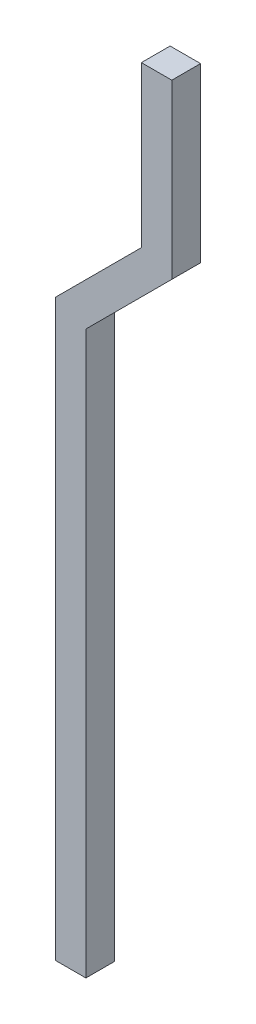
ISO-10303-21;
HEADER;
FILE_DESCRIPTION(('STEP AP214'),'2;1');
FILE_NAME('part.step','',(''),(''),'','','');
FILE_SCHEMA(('AUTOMOTIVE_DESIGN { 1 0 10303 214 1 1 1 1 }'));
ENDSEC;
DATA;
#1=APPLICATION_CONTEXT('core data for automotive mechanical design processes');
#2=APPLICATION_PROTOCOL_DEFINITION('international standard','automotive_design',2000,#1);
#3=PRODUCT_CONTEXT('',#1,'mechanical');
#4=PRODUCT('Part','Part','',(#3));
#5=PRODUCT_RELATED_PRODUCT_CATEGORY('part','',(#4));
#6=PRODUCT_DEFINITION_FORMATION('','',#4);
#7=PRODUCT_DEFINITION_CONTEXT('part definition',#1,'design');
#8=PRODUCT_DEFINITION('design','',#6,#7);
#9=PRODUCT_DEFINITION_SHAPE('','',#8);
#10=(LENGTH_UNIT() NAMED_UNIT(*) SI_UNIT(.MILLI.,.METRE.));
#11=(NAMED_UNIT(*) PLANE_ANGLE_UNIT() SI_UNIT($,.RADIAN.));
#12=(NAMED_UNIT(*) SI_UNIT($,.STERADIAN.) SOLID_ANGLE_UNIT());
#13=UNCERTAINTY_MEASURE_WITH_UNIT(LENGTH_MEASURE(1.E-05),#10,'distance_accuracy_value','');
#14=(GEOMETRIC_REPRESENTATION_CONTEXT(3) GLOBAL_UNCERTAINTY_ASSIGNED_CONTEXT((#13)) GLOBAL_UNIT_ASSIGNED_CONTEXT((#10,
#11,#12)) REPRESENTATION_CONTEXT('',''));
#15=CARTESIAN_POINT('',(0.,0.,0.));
#16=DIRECTION('',(0.,0.,1.));
#17=DIRECTION('',(1.,0.,0.));
#18=AXIS2_PLACEMENT_3D('',#15,#16,#17);
#19=CARTESIAN_POINT('',(-0.90050874,-6.350508,0.44500038));
#20=DIRECTION('',(0.,0.,-1.));
#21=DIRECTION('',(-1.,0.,0.));
#22=AXIS2_PLACEMENT_3D('',#19,#20,#21);
#23=PLANE('',#22);
#24=DIRECTION('',(0.,1.,0.));
#25=VECTOR('',#24,1.);
#26=CARTESIAN_POINT('',(-0.90050874,2.54020574,0.44500038));
#27=LINE('',#26,#25);
#28=CARTESIAN_POINT('',(-0.900428729999978,2.54030479999998,0.44500038));
#29=VERTEX_POINT('',#28);
#30=CARTESIAN_POINT('',(-0.90050874,-6.350508,0.44500038));
#31=VERTEX_POINT('',#30);
#32=EDGE_CURVE('E120',#29,#31,#27,.F.);
#33=ORIENTED_EDGE('',*,*,#32,.T.);
#34=DIRECTION('',(1.,0.,0.));
#35=VECTOR('',#34,1.);
#36=CARTESIAN_POINT('',(-0.90050874,-6.350508,0.44500038));
#37=LINE('',#36,#35);
#38=CARTESIAN_POINT('',(-0.42949114,-6.350508,0.44500038));
#39=VERTEX_POINT('',#38);
#40=EDGE_CURVE('E220',#31,#39,#37,.T.);
#41=ORIENTED_EDGE('',*,*,#40,.T.);
#42=DIRECTION('',(0.,1.,0.));
#43=VECTOR('',#42,1.);
#44=CARTESIAN_POINT('',(-0.42949114,-6.350508,0.44500038));
#45=LINE('',#44,#43);
#46=CARTESIAN_POINT('',(-0.42949114,2.3497921,0.44500038));
#47=VERTEX_POINT('',#46);
#48=EDGE_CURVE('E192',#39,#47,#45,.T.);
#49=ORIENTED_EDGE('',*,*,#48,.T.);
#50=DIRECTION('',(-0.707116910586994,-0.707096651640994,0.));
#51=VECTOR('',#50,1.);
#52=CARTESIAN_POINT('',(-0.42949114,2.3497921,0.44500038));
#53=LINE('',#52,#51);
#54=CARTESIAN_POINT('',(0.900428729999865,3.67969292000013,0.44500038));
#55=VERTEX_POINT('',#54);
#56=EDGE_CURVE('E193',#47,#55,#53,.F.);
#57=ORIENTED_EDGE('',*,*,#56,.T.);
#58=DIRECTION('',(0.,1.,0.));
#59=VECTOR('',#58,1.);
#60=CARTESIAN_POINT('',(0.90050874,3.67979198,0.44500038));
#61=LINE('',#60,#59);
#62=CARTESIAN_POINT('',(0.90050874,6.350508,0.44500038));
#63=VERTEX_POINT('',#62);
#64=EDGE_CURVE('E86',#55,#63,#61,.T.);
#65=ORIENTED_EDGE('',*,*,#64,.T.);
#66=DIRECTION('',(1.,0.,0.));
#67=VECTOR('',#66,1.);
#68=CARTESIAN_POINT('',(0.90050874,6.350508,0.44500038));
#69=LINE('',#68,#67);
#70=CARTESIAN_POINT('',(0.42949114,6.350508,0.44500038));
#71=VERTEX_POINT('',#70);
#72=EDGE_CURVE('E80',#63,#71,#69,.F.);
#73=ORIENTED_EDGE('',*,*,#72,.T.);
#74=CARTESIAN_POINT('',(0.42949114,6.350508,0.44500038));
#75=DIRECTION('',(0.,-1.,0.));
#76=VECTOR('',#75,1.);
#77=LINE('',#74,#76);
#78=CARTESIAN_POINT('',(0.42907839,3.86922221666667,0.44500038));
#79=VERTEX_POINT('',#78);
#80=EDGE_CURVE('E82',#71,#79,#77,.T.);
#81=ORIENTED_EDGE('',*,*,#80,.T.);
#82=DIRECTION('',(0.707116916878904,0.707096645348904,0.));
#83=VECTOR('',#82,1.);
#84=CARTESIAN_POINT('',(0.42866564,3.86938012,0.44500038));
#85=LINE('',#84,#83);
#86=EDGE_CURVE('E116',#79,#29,#85,.F.);
#87=ORIENTED_EDGE('',*,*,#86,.T.);
#88=EDGE_LOOP('',(#33,#41,#49,#57,#65,#73,#81,#87));
#89=FACE_BOUND('',#88,.T.);
#90=ADVANCED_FACE('F17',(#89),#23,.F.);
#91=CARTESIAN_POINT('',(0.42949114,6.350508,0.));
#92=DIRECTION('',(1.,0.,0.));
#93=DIRECTION('',(0.,0.,-1.));
#94=AXIS2_PLACEMENT_3D('',#91,#92,#93);
#95=PLANE('',#94);
#96=CARTESIAN_POINT('',(0.42949114,3.86906431333334,0.));
#97=DIRECTION('',(0.,0.,1.));
#98=VECTOR('',#97,1.);
#99=LINE('',#96,#98);
#100=CARTESIAN_POINT('',(0.429081377671007,3.86922221407069,0.));
#101=VERTEX_POINT('',#100);
#102=EDGE_CURVE('E98',#101,#79,#99,.T.);
#103=ORIENTED_EDGE('',*,*,#102,.T.);
#104=ORIENTED_EDGE('',*,*,#80,.F.);
#105=DIRECTION('',(0.,0.,-1.));
#106=VECTOR('',#105,1.);
#107=CARTESIAN_POINT('',(0.42949114,6.350508,0.));
#108=LINE('',#107,#106);
#109=CARTESIAN_POINT('',(0.42949114,6.350508,0.));
#110=VERTEX_POINT('',#109);
#111=EDGE_CURVE('E90',#71,#110,#108,.T.);
#112=ORIENTED_EDGE('',*,*,#111,.T.);
#113=DIRECTION('',(0.,1.,0.));
#114=VECTOR('',#113,1.);
#115=CARTESIAN_POINT('',(0.42949114,6.350508,0.));
#116=LINE('',#115,#114);
#117=EDGE_CURVE('E205',#101,#110,#116,.T.);
#118=ORIENTED_EDGE('',*,*,#117,.F.);
#119=EDGE_LOOP('',(#103,#104,#112,#118));
#120=FACE_BOUND('',#119,.T.);
#121=ADVANCED_FACE('F95',(#120),#95,.F.);
#122=CARTESIAN_POINT('',(0.90050874,6.350508,0.));
#123=DIRECTION('',(0.,-1.,0.));
#124=DIRECTION('',(0.,0.,-1.));
#125=AXIS2_PLACEMENT_3D('',#122,#123,#124);
#126=PLANE('',#125);
#127=ORIENTED_EDGE('',*,*,#111,.F.);
#128=ORIENTED_EDGE('',*,*,#72,.F.);
#129=DIRECTION('',(0.,0.,1.));
#130=VECTOR('',#129,1.);
#131=CARTESIAN_POINT('',(0.90050874,6.350508,0.));
#132=LINE('',#131,#130);
#133=CARTESIAN_POINT('',(0.90050874,6.350508,0.));
#134=VERTEX_POINT('',#133);
#135=EDGE_CURVE('E108',#63,#134,#132,.F.);
#136=ORIENTED_EDGE('',*,*,#135,.T.);
#137=DIRECTION('',(-1.,0.,0.));
#138=VECTOR('',#137,1.);
#139=CARTESIAN_POINT('',(-0.90050874,6.350508,0.));
#140=LINE('',#139,#138);
#141=EDGE_CURVE('E105',#110,#134,#140,.F.);
#142=ORIENTED_EDGE('',*,*,#141,.F.);
#143=EDGE_LOOP('',(#127,#128,#136,#142));
#144=FACE_BOUND('',#143,.T.);
#145=ADVANCED_FACE('F103',(#144),#126,.F.);
#146=CARTESIAN_POINT('',(0.90050874,3.67979198,0.));
#147=DIRECTION('',(-1.,0.,0.));
#148=DIRECTION('',(0.,0.,1.));
#149=AXIS2_PLACEMENT_3D('',#146,#147,#148);
#150=PLANE('',#149);
#151=ORIENTED_EDGE('',*,*,#135,.F.);
#152=ORIENTED_EDGE('',*,*,#64,.F.);
#153=CARTESIAN_POINT('',(0.90050874,3.67979198,0.44500038));
#154=DIRECTION('',(0.,0.,-1.));
#155=VECTOR('',#154,1.);
#156=LINE('',#153,#155);
#157=CARTESIAN_POINT('',(0.900428729999933,3.67969292000007,0.));
#158=VERTEX_POINT('',#157);
#159=EDGE_CURVE('E177',#55,#158,#156,.T.);
#160=ORIENTED_EDGE('',*,*,#159,.T.);
#161=DIRECTION('',(0.,1.,0.));
#162=VECTOR('',#161,1.);
#163=CARTESIAN_POINT('',(0.90050874,-6.350508,0.));
#164=LINE('',#163,#162);
#165=EDGE_CURVE('E190',#134,#158,#164,.F.);
#166=ORIENTED_EDGE('',*,*,#165,.F.);
#167=EDGE_LOOP('',(#151,#152,#160,#166));
#168=FACE_BOUND('',#167,.T.);
#169=ADVANCED_FACE('F158',(#168),#150,.F.);
#170=CARTESIAN_POINT('',(-0.42949114,2.3497921,0.));
#171=DIRECTION('',(-0.707096651640994,0.707116910586994,0.));
#172=DIRECTION('',(-0.707116910586994,-0.707096651640994,0.));
#173=AXIS2_PLACEMENT_3D('',#170,#171,#172);
#174=PLANE('',#173);
#175=ORIENTED_EDGE('',*,*,#159,.F.);
#176=ORIENTED_EDGE('',*,*,#56,.F.);
#177=DIRECTION('',(0.,0.,1.));
#178=VECTOR('',#177,1.);
#179=CARTESIAN_POINT('',(-0.42949114,2.3497921,0.));
#180=LINE('',#179,#178);
#181=CARTESIAN_POINT('',(-0.42949114,2.3497921,0.));
#182=VERTEX_POINT('',#181);
#183=EDGE_CURVE('E197',#47,#182,#180,.F.);
#184=ORIENTED_EDGE('',*,*,#183,.T.);
#185=DIRECTION('',(-0.707116910587137,-0.707096651640851,0.));
#186=VECTOR('',#185,1.);
#187=CARTESIAN_POINT('',(0.90034872,3.67959386,0.));
#188=LINE('',#187,#186);
#189=EDGE_CURVE('E195',#158,#182,#188,.T.);
#190=ORIENTED_EDGE('',*,*,#189,.F.);
#191=EDGE_LOOP('',(#175,#176,#184,#190));
#192=FACE_BOUND('',#191,.T.);
#193=ADVANCED_FACE('F153',(#192),#174,.F.);
#194=CARTESIAN_POINT('',(-0.42949114,-6.350508,0.));
#195=DIRECTION('',(-1.,0.,0.));
#196=DIRECTION('',(0.,0.,1.));
#197=AXIS2_PLACEMENT_3D('',#194,#195,#196);
#198=PLANE('',#197);
#199=ORIENTED_EDGE('',*,*,#183,.F.);
#200=ORIENTED_EDGE('',*,*,#48,.F.);
#201=DIRECTION('',(0.,0.,1.));
#202=VECTOR('',#201,1.);
#203=CARTESIAN_POINT('',(-0.42949114,-6.350508,0.));
#204=LINE('',#203,#202);
#205=CARTESIAN_POINT('',(-0.42949114,-6.350508,0.));
#206=VERTEX_POINT('',#205);
#207=EDGE_CURVE('E123',#39,#206,#204,.F.);
#208=ORIENTED_EDGE('',*,*,#207,.T.);
#209=DIRECTION('',(0.,1.,0.));
#210=VECTOR('',#209,1.);
#211=CARTESIAN_POINT('',(-0.42949114,-6.350508,0.));
#212=LINE('',#211,#210);
#213=EDGE_CURVE('E201',#182,#206,#212,.F.);
#214=ORIENTED_EDGE('',*,*,#213,.F.);
#215=EDGE_LOOP('',(#199,#200,#208,#214));
#216=FACE_BOUND('',#215,.T.);
#217=ADVANCED_FACE('F149',(#216),#198,.F.);
#218=CARTESIAN_POINT('',(-0.90050874,-6.350508,0.));
#219=DIRECTION('',(0.,1.,0.));
#220=DIRECTION('',(0.,0.,1.));
#221=AXIS2_PLACEMENT_3D('',#218,#219,#220);
#222=PLANE('',#221);
#223=ORIENTED_EDGE('',*,*,#207,.F.);
#224=ORIENTED_EDGE('',*,*,#40,.F.);
#225=DIRECTION('',(0.,0.,-1.));
#226=VECTOR('',#225,1.);
#227=CARTESIAN_POINT('',(-0.90050874,-6.350508,0.));
#228=LINE('',#227,#226);
#229=CARTESIAN_POINT('',(-0.90050874,-6.350508,0.));
#230=VERTEX_POINT('',#229);
#231=EDGE_CURVE('E122',#31,#230,#228,.T.);
#232=ORIENTED_EDGE('',*,*,#231,.T.);
#233=DIRECTION('',(-1.,0.,0.));
#234=VECTOR('',#233,1.);
#235=CARTESIAN_POINT('',(-0.90050874,-6.350508,0.));
#236=LINE('',#235,#234);
#237=EDGE_CURVE('E214',#206,#230,#236,.T.);
#238=ORIENTED_EDGE('',*,*,#237,.F.);
#239=EDGE_LOOP('',(#223,#224,#232,#238));
#240=FACE_BOUND('',#239,.T.);
#241=ADVANCED_FACE('F146',(#240),#222,.F.);
#242=CARTESIAN_POINT('',(-0.90050874,2.54020574,0.));
#243=DIRECTION('',(1.,0.,0.));
#244=DIRECTION('',(0.,0.,-1.));
#245=AXIS2_PLACEMENT_3D('',#242,#243,#244);
#246=PLANE('',#245);
#247=ORIENTED_EDGE('',*,*,#231,.F.);
#248=ORIENTED_EDGE('',*,*,#32,.F.);
#249=DIRECTION('',(0.,0.,-1.));
#250=VECTOR('',#249,1.);
#251=CARTESIAN_POINT('',(-0.90050874,2.54024384458734,0.));
#252=LINE('',#251,#250);
#253=CARTESIAN_POINT('',(-0.900428729999989,2.54030479999999,0.));
#254=VERTEX_POINT('',#253);
#255=EDGE_CURVE('E36',#29,#254,#252,.T.);
#256=ORIENTED_EDGE('',*,*,#255,.T.);
#257=DIRECTION('',(0.,1.,0.));
#258=VECTOR('',#257,1.);
#259=CARTESIAN_POINT('',(-0.90050874,-6.350508,0.));
#260=LINE('',#259,#258);
#261=EDGE_CURVE('E27',#230,#254,#260,.T.);
#262=ORIENTED_EDGE('',*,*,#261,.F.);
#263=EDGE_LOOP('',(#247,#248,#256,#262));
#264=FACE_BOUND('',#263,.T.);
#265=ADVANCED_FACE('F143',(#264),#246,.F.);
#266=CARTESIAN_POINT('',(0.42866564,3.86938012,0.));
#267=DIRECTION('',(0.707096645348904,-0.707116916878904,0.));
#268=DIRECTION('',(0.707116916878904,0.707096645348904,0.));
#269=AXIS2_PLACEMENT_3D('',#266,#267,#268);
#270=PLANE('',#269);
#271=ORIENTED_EDGE('',*,*,#255,.F.);
#272=ORIENTED_EDGE('',*,*,#86,.F.);
#273=ORIENTED_EDGE('',*,*,#102,.F.);
#274=DIRECTION('',(0.707116916878928,0.70709664534888,0.));
#275=VECTOR('',#274,1.);
#276=CARTESIAN_POINT('',(-0.90034872,2.54040386,0.));
#277=LINE('',#276,#275);
#278=EDGE_CURVE('E11',#254,#101,#277,.T.);
#279=ORIENTED_EDGE('',*,*,#278,.F.);
#280=EDGE_LOOP('',(#271,#272,#273,#279));
#281=FACE_BOUND('',#280,.T.);
#282=ADVANCED_FACE('F132',(#281),#270,.F.);
#283=CARTESIAN_POINT('',(-0.90050874,-6.350508,0.));
#284=DIRECTION('',(0.,0.,-1.));
#285=DIRECTION('',(-1.,0.,0.));
#286=AXIS2_PLACEMENT_3D('',#283,#284,#285);
#287=PLANE('',#286);
#288=ORIENTED_EDGE('',*,*,#261,.T.);
#289=ORIENTED_EDGE('',*,*,#278,.T.);
#290=ORIENTED_EDGE('',*,*,#117,.T.);
#291=ORIENTED_EDGE('',*,*,#141,.T.);
#292=ORIENTED_EDGE('',*,*,#165,.T.);
#293=ORIENTED_EDGE('',*,*,#189,.T.);
#294=ORIENTED_EDGE('',*,*,#213,.T.);
#295=ORIENTED_EDGE('',*,*,#237,.T.);
#296=EDGE_LOOP('',(#288,#289,#290,#291,#292,#293,#294,#295));
#297=FACE_BOUND('',#296,.T.);
#298=ADVANCED_FACE('F142',(#297),#287,.T.);
#299=CLOSED_SHELL('',(#90,#121,#145,#169,#193,#217,#241,#265,#282,#298));
#300=MANIFOLD_SOLID_BREP('B1',#299);
#301=ADVANCED_BREP_SHAPE_REPRESENTATION('',(#18,#300),#14);
#302=SHAPE_DEFINITION_REPRESENTATION(#9,#301);
ENDSEC;
END-ISO-10303-21;
